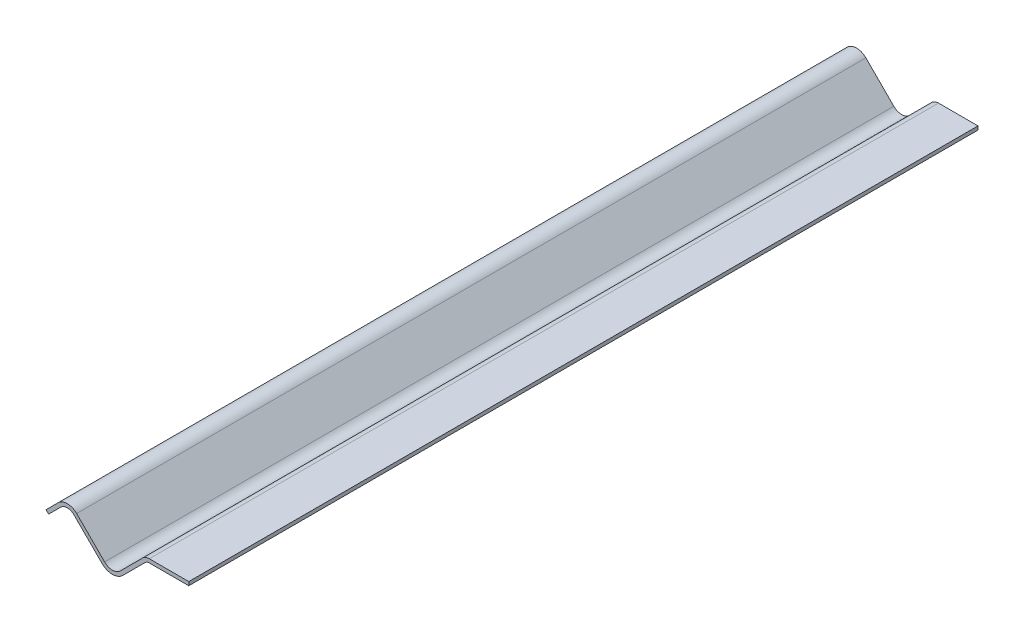
ISO-10303-21;
HEADER;
FILE_DESCRIPTION(('STEP AP214'),'2;1');
FILE_NAME('part.step','',(''),(''),'','','');
FILE_SCHEMA(('AUTOMOTIVE_DESIGN { 1 0 10303 214 1 1 1 1 }'));
ENDSEC;
DATA;
#1=APPLICATION_CONTEXT('core data for automotive mechanical design processes');
#2=APPLICATION_PROTOCOL_DEFINITION('international standard','automotive_design',2000,#1);
#3=PRODUCT_CONTEXT('',#1,'mechanical');
#4=PRODUCT('Part','Part','',(#3));
#5=PRODUCT_RELATED_PRODUCT_CATEGORY('part','',(#4));
#6=PRODUCT_DEFINITION_FORMATION('','',#4);
#7=PRODUCT_DEFINITION_CONTEXT('part definition',#1,'design');
#8=PRODUCT_DEFINITION('design','',#6,#7);
#9=PRODUCT_DEFINITION_SHAPE('','',#8);
#10=(LENGTH_UNIT() NAMED_UNIT(*) SI_UNIT(.MILLI.,.METRE.));
#11=(NAMED_UNIT(*) PLANE_ANGLE_UNIT() SI_UNIT($,.RADIAN.));
#12=(NAMED_UNIT(*) SI_UNIT($,.STERADIAN.) SOLID_ANGLE_UNIT());
#13=UNCERTAINTY_MEASURE_WITH_UNIT(LENGTH_MEASURE(1.E-05),#10,'distance_accuracy_value','');
#14=(GEOMETRIC_REPRESENTATION_CONTEXT(3) GLOBAL_UNCERTAINTY_ASSIGNED_CONTEXT((#13)) GLOBAL_UNIT_ASSIGNED_CONTEXT((#10,
#11,#12)) REPRESENTATION_CONTEXT('',''));
#15=CARTESIAN_POINT('',(0.,0.,0.));
#16=DIRECTION('',(0.,0.,1.));
#17=DIRECTION('',(1.,0.,0.));
#18=AXIS2_PLACEMENT_3D('',#15,#16,#17);
#19=CARTESIAN_POINT('',(0.497947792815748,-0.497947792815748,76.073));
#20=DIRECTION('',(0.707106781186547,0.707106781186548,0.));
#21=DIRECTION('',(-0.707106781186548,0.707106781186547,0.));
#22=AXIS2_PLACEMENT_3D('',#19,#20,#21);
#23=PLANE('',#22);
#24=DIRECTION('',(0.707106781186548,-0.707106781186547,0.));
#25=VECTOR('',#24,1.);
#26=CARTESIAN_POINT('',(0.497947792815748,-0.497947792815748,-76.073));
#27=LINE('',#26,#25);
#28=CARTESIAN_POINT('',(0.,0.,-76.073));
#29=VERTEX_POINT('',#28);
#30=CARTESIAN_POINT('',(0.497947792815748,-0.497947792815748,-76.073));
#31=VERTEX_POINT('',#30);
#32=EDGE_CURVE('E177',#29,#31,#27,.T.);
#33=ORIENTED_EDGE('',*,*,#32,.T.);
#34=DIRECTION('',(0.,0.,-1.));
#35=VECTOR('',#34,1.);
#36=CARTESIAN_POINT('',(0.497947792815748,-0.497947792815748,76.073));
#37=LINE('',#36,#35);
#38=CARTESIAN_POINT('',(0.497947792815748,-0.497947792815748,76.073));
#39=VERTEX_POINT('',#38);
#40=EDGE_CURVE('E11',#39,#31,#37,.T.);
#41=ORIENTED_EDGE('',*,*,#40,.F.);
#42=DIRECTION('',(0.707106781186548,-0.707106781186547,0.));
#43=VECTOR('',#42,1.);
#44=CARTESIAN_POINT('',(0.497947792815748,-0.497947792815748,76.073));
#45=LINE('',#44,#43);
#46=CARTESIAN_POINT('',(0.,0.,76.073));
#47=VERTEX_POINT('',#46);
#48=EDGE_CURVE('E207',#47,#39,#45,.T.);
#49=ORIENTED_EDGE('',*,*,#48,.F.);
#50=DIRECTION('',(0.,0.,-1.));
#51=VECTOR('',#50,1.);
#52=CARTESIAN_POINT('',(0.,0.,76.073));
#53=LINE('',#52,#51);
#54=EDGE_CURVE('E173',#47,#29,#53,.T.);
#55=ORIENTED_EDGE('',*,*,#54,.T.);
#56=EDGE_LOOP('',(#33,#41,#49,#55));
#57=FACE_BOUND('',#56,.T.);
#58=ADVANCED_FACE('F33',(#57),#23,.F.);
#59=CARTESIAN_POINT('',(2.81731108636415,1.82141550073266,76.073));
#60=DIRECTION('',(-0.707106781186549,0.707106781186546,0.));
#61=DIRECTION('',(-0.707106781186546,-0.707106781186549,0.));
#62=AXIS2_PLACEMENT_3D('',#59,#60,#61);
#63=PLANE('',#62);
#64=DIRECTION('',(0.707106781186546,0.707106781186549,0.));
#65=VECTOR('',#64,1.);
#66=CARTESIAN_POINT('',(2.81731108636415,1.82141550073266,-76.073));
#67=LINE('',#66,#65);
#68=CARTESIAN_POINT('',(2.81731108636415,1.82141550073266,-76.073));
#69=VERTEX_POINT('',#68);
#70=EDGE_CURVE('E180',#31,#69,#67,.T.);
#71=ORIENTED_EDGE('',*,*,#70,.T.);
#72=DIRECTION('',(0.,0.,-1.));
#73=VECTOR('',#72,1.);
#74=CARTESIAN_POINT('',(2.81731108636415,1.82141550073266,76.073));
#75=LINE('',#74,#73);
#76=CARTESIAN_POINT('',(2.81731108636415,1.82141550073266,76.073));
#77=VERTEX_POINT('',#76);
#78=EDGE_CURVE('E41',#77,#69,#75,.T.);
#79=ORIENTED_EDGE('',*,*,#78,.F.);
#80=DIRECTION('',(0.707106781186546,0.707106781186549,0.));
#81=VECTOR('',#80,1.);
#82=CARTESIAN_POINT('',(2.81731108636415,1.82141550073266,76.073));
#83=LINE('',#82,#81);
#84=EDGE_CURVE('E116',#39,#77,#83,.T.);
#85=ORIENTED_EDGE('',*,*,#84,.F.);
#86=ORIENTED_EDGE('',*,*,#40,.T.);
#87=EDGE_LOOP('',(#71,#79,#85,#86));
#88=FACE_BOUND('',#87,.T.);
#89=ADVANCED_FACE('F305',(#88),#63,.F.);
#90=CARTESIAN_POINT('',(4.11283416820805,0.525892418888756,76.073));
#91=DIRECTION('',(0.,0.,-1.));
#92=DIRECTION('',(-1.,0.,0.));
#93=AXIS2_PLACEMENT_3D('',#90,#91,#92);
#94=CYLINDRICAL_SURFACE('',#93,1.83214631271104);
#95=CARTESIAN_POINT('',(4.11283416820805,0.525892418888756,-76.073));
#96=DIRECTION('',(0.,0.,-1.));
#97=DIRECTION('',(1.,0.,0.));
#98=AXIS2_PLACEMENT_3D('',#95,#96,#97);
#99=CIRCLE('',#98,1.83214631271104);
#100=CARTESIAN_POINT('',(5.40835725005195,1.82141550073266,-76.073));
#101=VERTEX_POINT('',#100);
#102=EDGE_CURVE('E182',#69,#101,#99,.T.);
#103=ORIENTED_EDGE('',*,*,#102,.T.);
#104=DIRECTION('',(0.,0.,-1.));
#105=VECTOR('',#104,1.);
#106=CARTESIAN_POINT('',(5.40835725005195,1.82141550073266,76.073));
#107=LINE('',#106,#105);
#108=CARTESIAN_POINT('',(5.40835725005195,1.82141550073266,76.073));
#109=VERTEX_POINT('',#108);
#110=EDGE_CURVE('E238',#109,#101,#107,.T.);
#111=ORIENTED_EDGE('',*,*,#110,.F.);
#112=CARTESIAN_POINT('',(4.11283416820805,0.525892418888756,76.073));
#113=DIRECTION('',(0.,0.,-1.));
#114=DIRECTION('',(1.,0.,0.));
#115=AXIS2_PLACEMENT_3D('',#112,#113,#114);
#116=CIRCLE('',#115,1.83214631271104);
#117=EDGE_CURVE('E246',#77,#109,#116,.T.);
#118=ORIENTED_EDGE('',*,*,#117,.F.);
#119=ORIENTED_EDGE('',*,*,#78,.T.);
#120=EDGE_LOOP('',(#103,#111,#118,#119));
#121=FACE_BOUND('',#120,.T.);
#122=ADVANCED_FACE('F244',(#121),#94,.F.);
#123=CARTESIAN_POINT('',(10.7965109226934,-3.56673817190883,76.073));
#124=DIRECTION('',(0.707106781186547,0.707106781186548,0.));
#125=DIRECTION('',(-0.707106781186548,0.707106781186547,0.));
#126=AXIS2_PLACEMENT_3D('',#123,#124,#125);
#127=PLANE('',#126);
#128=DIRECTION('',(0.707106781186548,-0.707106781186547,0.));
#129=VECTOR('',#128,1.);
#130=CARTESIAN_POINT('',(10.7965109226934,-3.56673817190883,-76.073));
#131=LINE('',#130,#129);
#132=CARTESIAN_POINT('',(10.7965109226934,-3.56673817190883,-76.073));
#133=VERTEX_POINT('',#132);
#134=EDGE_CURVE('E184',#101,#133,#131,.T.);
#135=ORIENTED_EDGE('',*,*,#134,.T.);
#136=DIRECTION('',(0.,0.,-1.));
#137=VECTOR('',#136,1.);
#138=CARTESIAN_POINT('',(10.7965109226934,-3.56673817190883,76.073));
#139=LINE('',#138,#137);
#140=CARTESIAN_POINT('',(10.7965109226934,-3.56673817190883,76.073));
#141=VERTEX_POINT('',#140);
#142=EDGE_CURVE('E235',#141,#133,#139,.T.);
#143=ORIENTED_EDGE('',*,*,#142,.F.);
#144=DIRECTION('',(0.707106781186548,-0.707106781186547,0.));
#145=VECTOR('',#144,1.);
#146=CARTESIAN_POINT('',(10.7965109226934,-3.56673817190883,76.073));
#147=LINE('',#146,#145);
#148=EDGE_CURVE('E264',#109,#141,#147,.T.);
#149=ORIENTED_EDGE('',*,*,#148,.F.);
#150=ORIENTED_EDGE('',*,*,#110,.T.);
#151=EDGE_LOOP('',(#135,#143,#149,#150));
#152=FACE_BOUND('',#151,.T.);
#153=ADVANCED_FACE('F255',(#152),#127,.F.);
#154=CARTESIAN_POINT('',(12.8019671361045,-1.56128195849773,76.073));
#155=DIRECTION('',(0.,0.,-1.));
#156=DIRECTION('',(-1.,0.,0.));
#157=AXIS2_PLACEMENT_3D('',#154,#155,#156);
#158=CYLINDRICAL_SURFACE('',#157,2.83614337575137);
#159=CARTESIAN_POINT('',(12.8019671361045,-1.56128195849773,-76.073));
#160=DIRECTION('',(0.,0.,1.));
#161=DIRECTION('',(-1.,0.,0.));
#162=AXIS2_PLACEMENT_3D('',#159,#160,#161);
#163=CIRCLE('',#162,2.83614337575137);
#164=CARTESIAN_POINT('',(14.8074233495156,-3.56673817190883,-76.073));
#165=VERTEX_POINT('',#164);
#166=EDGE_CURVE('E186',#133,#165,#163,.T.);
#167=ORIENTED_EDGE('',*,*,#166,.T.);
#168=DIRECTION('',(0.,0.,-1.));
#169=VECTOR('',#168,1.);
#170=CARTESIAN_POINT('',(14.8074233495156,-3.56673817190883,76.073));
#171=LINE('',#170,#169);
#172=CARTESIAN_POINT('',(14.8074233495156,-3.56673817190883,76.073));
#173=VERTEX_POINT('',#172);
#174=EDGE_CURVE('E232',#173,#165,#171,.T.);
#175=ORIENTED_EDGE('',*,*,#174,.F.);
#176=CARTESIAN_POINT('',(12.8019671361045,-1.56128195849773,76.073));
#177=DIRECTION('',(0.,0.,1.));
#178=DIRECTION('',(-1.,0.,0.));
#179=AXIS2_PLACEMENT_3D('',#176,#177,#178);
#180=CIRCLE('',#179,2.83614337575137);
#181=EDGE_CURVE('E261',#141,#173,#180,.T.);
#182=ORIENTED_EDGE('',*,*,#181,.F.);
#183=ORIENTED_EDGE('',*,*,#142,.T.);
#184=EDGE_LOOP('',(#167,#175,#182,#183));
#185=FACE_BOUND('',#184,.T.);
#186=ADVANCED_FACE('F259',(#185),#158,.T.);
#187=CARTESIAN_POINT('',(19.1097693285375,0.735607807113074,76.073));
#188=DIRECTION('',(-0.707106781186548,0.707106781186547,0.));
#189=DIRECTION('',(-0.707106781186547,-0.707106781186548,0.));
#190=AXIS2_PLACEMENT_3D('',#187,#188,#189);
#191=PLANE('',#190);
#192=DIRECTION('',(0.707106781186547,0.707106781186548,0.));
#193=VECTOR('',#192,1.);
#194=CARTESIAN_POINT('',(19.1097693285375,0.735607807113074,-76.073));
#195=LINE('',#194,#193);
#196=CARTESIAN_POINT('',(19.1097693285375,0.735607807113074,-76.073));
#197=VERTEX_POINT('',#196);
#198=EDGE_CURVE('E188',#165,#197,#195,.T.);
#199=ORIENTED_EDGE('',*,*,#198,.T.);
#200=DIRECTION('',(0.,0.,-1.));
#201=VECTOR('',#200,1.);
#202=CARTESIAN_POINT('',(19.1097693285375,0.735607807113074,76.073));
#203=LINE('',#202,#201);
#204=CARTESIAN_POINT('',(19.1097693285375,0.735607807113074,76.073));
#205=VERTEX_POINT('',#204);
#206=EDGE_CURVE('E229',#205,#197,#203,.T.);
#207=ORIENTED_EDGE('',*,*,#206,.F.);
#208=DIRECTION('',(0.707106781186547,0.707106781186548,0.));
#209=VECTOR('',#208,1.);
#210=CARTESIAN_POINT('',(19.1097693285375,0.735607807113074,76.073));
#211=LINE('',#210,#209);
#212=EDGE_CURVE('E263',#173,#205,#211,.T.);
#213=ORIENTED_EDGE('',*,*,#212,.F.);
#214=ORIENTED_EDGE('',*,*,#174,.T.);
#215=EDGE_LOOP('',(#199,#207,#213,#214));
#216=FACE_BOUND('',#215,.T.);
#217=ADVANCED_FACE('F318',(#216),#191,.F.);
#218=CARTESIAN_POINT('',(19.9022764008965,-0.0568992652459051,76.073));
#219=DIRECTION('',(0.,0.,-1.));
#220=DIRECTION('',(-1.,0.,0.));
#221=AXIS2_PLACEMENT_3D('',#218,#219,#220);
#222=CYLINDRICAL_SURFACE('',#221,1.12077425000666);
#223=CARTESIAN_POINT('',(19.9022764008965,-0.0568992652459051,-76.073));
#224=DIRECTION('',(0.,0.,-1.));
#225=DIRECTION('',(1.,0.,0.));
#226=AXIS2_PLACEMENT_3D('',#223,#224,#225);
#227=CIRCLE('',#226,1.12077425000666);
#228=CARTESIAN_POINT('',(19.9022764008965,1.06387498476076,-76.073));
#229=VERTEX_POINT('',#228);
#230=EDGE_CURVE('E190',#197,#229,#227,.T.);
#231=ORIENTED_EDGE('',*,*,#230,.T.);
#232=DIRECTION('',(0.,0.,-1.));
#233=VECTOR('',#232,1.);
#234=CARTESIAN_POINT('',(19.9022764008965,1.06387498476076,76.073));
#235=LINE('',#234,#233);
#236=CARTESIAN_POINT('',(19.9022764008965,1.06387498476076,76.073));
#237=VERTEX_POINT('',#236);
#238=EDGE_CURVE('E226',#237,#229,#235,.T.);
#239=ORIENTED_EDGE('',*,*,#238,.F.);
#240=CARTESIAN_POINT('',(19.9022764008965,-0.0568992652459051,76.073));
#241=DIRECTION('',(0.,0.,-1.));
#242=DIRECTION('',(1.,0.,0.));
#243=AXIS2_PLACEMENT_3D('',#240,#241,#242);
#244=CIRCLE('',#243,1.12077425000666);
#245=EDGE_CURVE('E266',#205,#237,#244,.T.);
#246=ORIENTED_EDGE('',*,*,#245,.F.);
#247=ORIENTED_EDGE('',*,*,#206,.T.);
#248=EDGE_LOOP('',(#231,#239,#246,#247));
#249=FACE_BOUND('',#248,.T.);
#250=ADVANCED_FACE('F321',(#249),#222,.F.);
#251=CARTESIAN_POINT('',(27.5222764008965,1.06387498476076,76.073));
#252=DIRECTION('',(0.,1.,0.));
#253=DIRECTION('',(-1.,0.,0.));
#254=AXIS2_PLACEMENT_3D('',#251,#252,#253);
#255=PLANE('',#254);
#256=DIRECTION('',(1.,0.,0.));
#257=VECTOR('',#256,1.);
#258=CARTESIAN_POINT('',(27.5222764008965,1.06387498476076,-76.073));
#259=LINE('',#258,#257);
#260=CARTESIAN_POINT('',(27.5222764008965,1.06387498476076,-76.073));
#261=VERTEX_POINT('',#260);
#262=EDGE_CURVE('E192',#229,#261,#259,.T.);
#263=ORIENTED_EDGE('',*,*,#262,.T.);
#264=DIRECTION('',(0.,0.,-1.));
#265=VECTOR('',#264,1.);
#266=CARTESIAN_POINT('',(27.5222764008965,1.06387498476076,76.073));
#267=LINE('',#266,#265);
#268=CARTESIAN_POINT('',(27.5222764008965,1.06387498476076,76.073));
#269=VERTEX_POINT('',#268);
#270=EDGE_CURVE('E223',#269,#261,#267,.T.);
#271=ORIENTED_EDGE('',*,*,#270,.F.);
#272=DIRECTION('',(1.,0.,0.));
#273=VECTOR('',#272,1.);
#274=CARTESIAN_POINT('',(27.5222764008965,1.06387498476076,76.073));
#275=LINE('',#274,#273);
#276=EDGE_CURVE('E272',#237,#269,#275,.T.);
#277=ORIENTED_EDGE('',*,*,#276,.F.);
#278=ORIENTED_EDGE('',*,*,#238,.T.);
#279=EDGE_LOOP('',(#263,#271,#277,#278));
#280=FACE_BOUND('',#279,.T.);
#281=ADVANCED_FACE('F325',(#280),#255,.F.);
#282=CARTESIAN_POINT('',(27.5222764008965,1.76807950671453,76.073));
#283=DIRECTION('',(-1.,0.,0.));
#284=DIRECTION('',(0.,0.,1.));
#285=AXIS2_PLACEMENT_3D('',#282,#283,#284);
#286=PLANE('',#285);
#287=DIRECTION('',(0.,1.,0.));
#288=VECTOR('',#287,1.);
#289=CARTESIAN_POINT('',(27.5222764008965,1.76807950671453,-76.073));
#290=LINE('',#289,#288);
#291=CARTESIAN_POINT('',(27.5222764008965,1.76807950671453,-76.073));
#292=VERTEX_POINT('',#291);
#293=EDGE_CURVE('E194',#261,#292,#290,.T.);
#294=ORIENTED_EDGE('',*,*,#293,.T.);
#295=DIRECTION('',(0.,0.,-1.));
#296=VECTOR('',#295,1.);
#297=CARTESIAN_POINT('',(27.5222764008965,1.76807950671453,76.073));
#298=LINE('',#297,#296);
#299=CARTESIAN_POINT('',(27.5222764008965,1.76807950671453,76.073));
#300=VERTEX_POINT('',#299);
#301=EDGE_CURVE('E220',#300,#292,#298,.T.);
#302=ORIENTED_EDGE('',*,*,#301,.F.);
#303=DIRECTION('',(0.,1.,0.));
#304=VECTOR('',#303,1.);
#305=CARTESIAN_POINT('',(27.5222764008965,1.76807950671453,76.073));
#306=LINE('',#305,#304);
#307=EDGE_CURVE('E274',#269,#300,#306,.T.);
#308=ORIENTED_EDGE('',*,*,#307,.F.);
#309=ORIENTED_EDGE('',*,*,#270,.T.);
#310=EDGE_LOOP('',(#294,#302,#308,#309));
#311=FACE_BOUND('',#310,.T.);
#312=ADVANCED_FACE('F329',(#311),#286,.F.);
#313=CARTESIAN_POINT('',(19.9022764008965,1.76807950671453,76.073));
#314=DIRECTION('',(0.,-1.,0.));
#315=DIRECTION('',(0.,0.,-1.));
#316=AXIS2_PLACEMENT_3D('',#313,#314,#315);
#317=PLANE('',#316);
#318=DIRECTION('',(-1.,0.,0.));
#319=VECTOR('',#318,1.);
#320=CARTESIAN_POINT('',(19.9022764008965,1.76807950671453,-76.073));
#321=LINE('',#320,#319);
#322=CARTESIAN_POINT('',(19.9022764008965,1.76807950671453,-76.073));
#323=VERTEX_POINT('',#322);
#324=EDGE_CURVE('E196',#292,#323,#321,.T.);
#325=ORIENTED_EDGE('',*,*,#324,.T.);
#326=DIRECTION('',(0.,0.,-1.));
#327=VECTOR('',#326,1.);
#328=CARTESIAN_POINT('',(19.9022764008965,1.76807950671453,76.073));
#329=LINE('',#328,#327);
#330=CARTESIAN_POINT('',(19.9022764008965,1.76807950671453,76.073));
#331=VERTEX_POINT('',#330);
#332=EDGE_CURVE('E217',#331,#323,#329,.T.);
#333=ORIENTED_EDGE('',*,*,#332,.F.);
#334=DIRECTION('',(-1.,0.,0.));
#335=VECTOR('',#334,1.);
#336=CARTESIAN_POINT('',(19.9022764008965,1.76807950671453,76.073));
#337=LINE('',#336,#335);
#338=EDGE_CURVE('E276',#300,#331,#337,.T.);
#339=ORIENTED_EDGE('',*,*,#338,.F.);
#340=ORIENTED_EDGE('',*,*,#301,.T.);
#341=EDGE_LOOP('',(#325,#333,#339,#340));
#342=FACE_BOUND('',#341,.T.);
#343=ADVANCED_FACE('F333',(#342),#317,.F.);
#344=CARTESIAN_POINT('',(19.9022764008965,-0.0568992652459051,76.073));
#345=DIRECTION('',(0.,0.,-1.));
#346=DIRECTION('',(-1.,0.,0.));
#347=AXIS2_PLACEMENT_3D('',#344,#345,#346);
#348=CYLINDRICAL_SURFACE('',#347,1.82497877196044);
#349=CARTESIAN_POINT('',(19.9022764008965,-0.0568992652459051,-76.073));
#350=DIRECTION('',(0.,0.,1.));
#351=DIRECTION('',(-1.,0.,0.));
#352=AXIS2_PLACEMENT_3D('',#349,#350,#351);
#353=CIRCLE('',#352,1.82497877196044);
#354=CARTESIAN_POINT('',(18.6118215357218,1.23355559992882,-76.073));
#355=VERTEX_POINT('',#354);
#356=EDGE_CURVE('E198',#323,#355,#353,.T.);
#357=ORIENTED_EDGE('',*,*,#356,.T.);
#358=DIRECTION('',(0.,0.,-1.));
#359=VECTOR('',#358,1.);
#360=CARTESIAN_POINT('',(18.6118215357218,1.23355559992882,76.073));
#361=LINE('',#360,#359);
#362=CARTESIAN_POINT('',(18.6118215357218,1.23355559992882,76.073));
#363=VERTEX_POINT('',#362);
#364=EDGE_CURVE('E214',#363,#355,#361,.T.);
#365=ORIENTED_EDGE('',*,*,#364,.F.);
#366=CARTESIAN_POINT('',(19.9022764008965,-0.0568992652459051,76.073));
#367=DIRECTION('',(0.,0.,1.));
#368=DIRECTION('',(-1.,0.,0.));
#369=AXIS2_PLACEMENT_3D('',#366,#367,#368);
#370=CIRCLE('',#369,1.82497877196044);
#371=EDGE_CURVE('E278',#331,#363,#370,.T.);
#372=ORIENTED_EDGE('',*,*,#371,.F.);
#373=ORIENTED_EDGE('',*,*,#332,.T.);
#374=EDGE_LOOP('',(#357,#365,#372,#373));
#375=FACE_BOUND('',#374,.T.);
#376=ADVANCED_FACE('F337',(#375),#348,.T.);
#377=CARTESIAN_POINT('',(14.3094755566999,-3.06879037909308,76.073));
#378=DIRECTION('',(0.707106781186548,-0.707106781186547,0.));
#379=DIRECTION('',(0.707106781186547,0.707106781186548,0.));
#380=AXIS2_PLACEMENT_3D('',#377,#378,#379);
#381=PLANE('',#380);
#382=DIRECTION('',(-0.707106781186547,-0.707106781186548,0.));
#383=VECTOR('',#382,1.);
#384=CARTESIAN_POINT('',(14.3094755566999,-3.06879037909308,-76.073));
#385=LINE('',#384,#383);
#386=CARTESIAN_POINT('',(14.3094755566999,-3.06879037909308,-76.073));
#387=VERTEX_POINT('',#386);
#388=EDGE_CURVE('E200',#355,#387,#385,.T.);
#389=ORIENTED_EDGE('',*,*,#388,.T.);
#390=DIRECTION('',(0.,0.,-1.));
#391=VECTOR('',#390,1.);
#392=CARTESIAN_POINT('',(14.3094755566999,-3.06879037909308,76.073));
#393=LINE('',#392,#391);
#394=CARTESIAN_POINT('',(14.3094755566999,-3.06879037909308,76.073));
#395=VERTEX_POINT('',#394);
#396=EDGE_CURVE('E211',#395,#387,#393,.T.);
#397=ORIENTED_EDGE('',*,*,#396,.F.);
#398=DIRECTION('',(-0.707106781186547,-0.707106781186548,0.));
#399=VECTOR('',#398,1.);
#400=CARTESIAN_POINT('',(14.3094755566999,-3.06879037909308,76.073));
#401=LINE('',#400,#399);
#402=EDGE_CURVE('E280',#363,#395,#401,.T.);
#403=ORIENTED_EDGE('',*,*,#402,.F.);
#404=ORIENTED_EDGE('',*,*,#364,.T.);
#405=EDGE_LOOP('',(#389,#397,#403,#404));
#406=FACE_BOUND('',#405,.T.);
#407=ADVANCED_FACE('F286',(#406),#381,.F.);
#408=CARTESIAN_POINT('',(12.8019671361045,-1.56128195849773,76.073));
#409=DIRECTION('',(0.,0.,-1.));
#410=DIRECTION('',(-1.,0.,0.));
#411=AXIS2_PLACEMENT_3D('',#408,#409,#410);
#412=CYLINDRICAL_SURFACE('',#411,2.13193885379759);
#413=CARTESIAN_POINT('',(12.8019671361045,-1.56128195849773,-76.073));
#414=DIRECTION('',(0.,0.,-1.));
#415=DIRECTION('',(1.,0.,0.));
#416=AXIS2_PLACEMENT_3D('',#413,#414,#415);
#417=CIRCLE('',#416,2.13193885379759);
#418=CARTESIAN_POINT('',(11.2944587155092,-3.06879037909308,-76.073));
#419=VERTEX_POINT('',#418);
#420=EDGE_CURVE('E202',#387,#419,#417,.T.);
#421=ORIENTED_EDGE('',*,*,#420,.T.);
#422=DIRECTION('',(0.,0.,-1.));
#423=VECTOR('',#422,1.);
#424=CARTESIAN_POINT('',(11.2944587155092,-3.06879037909308,76.073));
#425=LINE('',#424,#423);
#426=CARTESIAN_POINT('',(11.2944587155092,-3.06879037909308,76.073));
#427=VERTEX_POINT('',#426);
#428=EDGE_CURVE('E168',#427,#419,#425,.T.);
#429=ORIENTED_EDGE('',*,*,#428,.F.);
#430=CARTESIAN_POINT('',(12.8019671361045,-1.56128195849773,76.073));
#431=DIRECTION('',(0.,0.,-1.));
#432=DIRECTION('',(1.,0.,0.));
#433=AXIS2_PLACEMENT_3D('',#430,#431,#432);
#434=CIRCLE('',#433,2.13193885379759);
#435=EDGE_CURVE('E159',#395,#427,#434,.T.);
#436=ORIENTED_EDGE('',*,*,#435,.F.);
#437=ORIENTED_EDGE('',*,*,#396,.T.);
#438=EDGE_LOOP('',(#421,#429,#436,#437));
#439=FACE_BOUND('',#438,.T.);
#440=ADVANCED_FACE('F290',(#439),#412,.F.);
#441=CARTESIAN_POINT('',(5.9063050428677,2.31936329354841,76.073));
#442=DIRECTION('',(-0.707106781186547,-0.707106781186548,0.));
#443=DIRECTION('',(0.707106781186548,-0.707106781186547,0.));
#444=AXIS2_PLACEMENT_3D('',#441,#442,#443);
#445=PLANE('',#444);
#446=DIRECTION('',(-0.707106781186548,0.707106781186547,0.));
#447=VECTOR('',#446,1.);
#448=CARTESIAN_POINT('',(5.9063050428677,2.31936329354841,-76.073));
#449=LINE('',#448,#447);
#450=CARTESIAN_POINT('',(5.9063050428677,2.31936329354841,-76.073));
#451=VERTEX_POINT('',#450);
#452=EDGE_CURVE('E167',#419,#451,#449,.T.);
#453=ORIENTED_EDGE('',*,*,#452,.T.);
#454=DIRECTION('',(0.,0.,-1.));
#455=VECTOR('',#454,1.);
#456=CARTESIAN_POINT('',(5.9063050428677,2.31936329354841,76.073));
#457=LINE('',#456,#455);
#458=CARTESIAN_POINT('',(5.9063050428677,2.31936329354841,76.073));
#459=VERTEX_POINT('',#458);
#460=EDGE_CURVE('E164',#459,#451,#457,.T.);
#461=ORIENTED_EDGE('',*,*,#460,.F.);
#462=DIRECTION('',(-0.707106781186548,0.707106781186547,0.));
#463=VECTOR('',#462,1.);
#464=CARTESIAN_POINT('',(5.9063050428677,2.31936329354841,76.073));
#465=LINE('',#464,#463);
#466=EDGE_CURVE('E153',#427,#459,#465,.T.);
#467=ORIENTED_EDGE('',*,*,#466,.F.);
#468=ORIENTED_EDGE('',*,*,#428,.T.);
#469=EDGE_LOOP('',(#453,#461,#467,#468));
#470=FACE_BOUND('',#469,.T.);
#471=ADVANCED_FACE('F165',(#470),#445,.F.);
#472=CARTESIAN_POINT('',(4.11283416820805,0.525892418888756,76.073));
#473=DIRECTION('',(0.,0.,-1.));
#474=DIRECTION('',(-1.,0.,0.));
#475=AXIS2_PLACEMENT_3D('',#472,#473,#474);
#476=CYLINDRICAL_SURFACE('',#475,2.53635083466481);
#477=CARTESIAN_POINT('',(4.11283416820805,0.525892418888756,-76.073));
#478=DIRECTION('',(0.,0.,1.));
#479=DIRECTION('',(-1.,0.,0.));
#480=AXIS2_PLACEMENT_3D('',#477,#478,#479);
#481=CIRCLE('',#480,2.53635083466481);
#482=CARTESIAN_POINT('',(2.3193632935484,2.31936329354841,-76.073));
#483=VERTEX_POINT('',#482);
#484=EDGE_CURVE('E102',#451,#483,#481,.T.);
#485=ORIENTED_EDGE('',*,*,#484,.T.);
#486=DIRECTION('',(0.,0.,-1.));
#487=VECTOR('',#486,1.);
#488=CARTESIAN_POINT('',(2.3193632935484,2.31936329354841,76.073));
#489=LINE('',#488,#487);
#490=CARTESIAN_POINT('',(2.3193632935484,2.31936329354841,76.073));
#491=VERTEX_POINT('',#490);
#492=EDGE_CURVE('E169',#491,#483,#489,.T.);
#493=ORIENTED_EDGE('',*,*,#492,.F.);
#494=CARTESIAN_POINT('',(4.11283416820805,0.525892418888756,76.073));
#495=DIRECTION('',(0.,0.,1.));
#496=DIRECTION('',(-1.,0.,0.));
#497=AXIS2_PLACEMENT_3D('',#494,#495,#496);
#498=CIRCLE('',#497,2.53635083466481);
#499=EDGE_CURVE('E157',#459,#491,#498,.T.);
#500=ORIENTED_EDGE('',*,*,#499,.F.);
#501=ORIENTED_EDGE('',*,*,#460,.T.);
#502=EDGE_LOOP('',(#485,#493,#500,#501));
#503=FACE_BOUND('',#502,.T.);
#504=ADVANCED_FACE('F171',(#503),#476,.T.);
#505=CARTESIAN_POINT('',(0.,0.,76.073));
#506=DIRECTION('',(0.707106781186548,-0.707106781186547,0.));
#507=DIRECTION('',(0.707106781186547,0.707106781186548,0.));
#508=AXIS2_PLACEMENT_3D('',#505,#506,#507);
#509=PLANE('',#508);
#510=DIRECTION('',(-0.707106781186547,-0.707106781186548,0.));
#511=VECTOR('',#510,1.);
#512=CARTESIAN_POINT('',(0.,0.,-76.073));
#513=LINE('',#512,#511);
#514=EDGE_CURVE('E108',#483,#29,#513,.T.);
#515=ORIENTED_EDGE('',*,*,#514,.T.);
#516=ORIENTED_EDGE('',*,*,#54,.F.);
#517=DIRECTION('',(-0.707106781186547,-0.707106781186548,0.));
#518=VECTOR('',#517,1.);
#519=CARTESIAN_POINT('',(0.,0.,76.073));
#520=LINE('',#519,#518);
#521=EDGE_CURVE('E49',#491,#47,#520,.T.);
#522=ORIENTED_EDGE('',*,*,#521,.F.);
#523=ORIENTED_EDGE('',*,*,#492,.T.);
#524=EDGE_LOOP('',(#515,#516,#522,#523));
#525=FACE_BOUND('',#524,.T.);
#526=ADVANCED_FACE('F294',(#525),#509,.F.);
#527=CARTESIAN_POINT('',(4.11283416820805,0.525892418888756,76.073));
#528=DIRECTION('',(0.,0.,-1.));
#529=DIRECTION('',(-1.,0.,0.));
#530=AXIS2_PLACEMENT_3D('',#527,#528,#529);
#531=PLANE('',#530);
#532=ORIENTED_EDGE('',*,*,#48,.T.);
#533=ORIENTED_EDGE('',*,*,#84,.T.);
#534=ORIENTED_EDGE('',*,*,#117,.T.);
#535=ORIENTED_EDGE('',*,*,#148,.T.);
#536=ORIENTED_EDGE('',*,*,#181,.T.);
#537=ORIENTED_EDGE('',*,*,#212,.T.);
#538=ORIENTED_EDGE('',*,*,#245,.T.);
#539=ORIENTED_EDGE('',*,*,#276,.T.);
#540=ORIENTED_EDGE('',*,*,#307,.T.);
#541=ORIENTED_EDGE('',*,*,#338,.T.);
#542=ORIENTED_EDGE('',*,*,#371,.T.);
#543=ORIENTED_EDGE('',*,*,#402,.T.);
#544=ORIENTED_EDGE('',*,*,#435,.T.);
#545=ORIENTED_EDGE('',*,*,#466,.T.);
#546=ORIENTED_EDGE('',*,*,#499,.T.);
#547=ORIENTED_EDGE('',*,*,#521,.T.);
#548=EDGE_LOOP('',(#532,#533,#534,#535,#536,#537,#538,#539,#540,#541,#542,#543,#544,#545,#546,#547));
#549=FACE_BOUND('',#548,.T.);
#550=ADVANCED_FACE('F155',(#549),#531,.F.);
#551=CARTESIAN_POINT('',(4.11283416820805,0.525892418888756,-76.073));
#552=DIRECTION('',(0.,0.,-1.));
#553=DIRECTION('',(-1.,0.,0.));
#554=AXIS2_PLACEMENT_3D('',#551,#552,#553);
#555=PLANE('',#554);
#556=ORIENTED_EDGE('',*,*,#32,.F.);
#557=ORIENTED_EDGE('',*,*,#514,.F.);
#558=ORIENTED_EDGE('',*,*,#484,.F.);
#559=ORIENTED_EDGE('',*,*,#452,.F.);
#560=ORIENTED_EDGE('',*,*,#420,.F.);
#561=ORIENTED_EDGE('',*,*,#388,.F.);
#562=ORIENTED_EDGE('',*,*,#356,.F.);
#563=ORIENTED_EDGE('',*,*,#324,.F.);
#564=ORIENTED_EDGE('',*,*,#293,.F.);
#565=ORIENTED_EDGE('',*,*,#262,.F.);
#566=ORIENTED_EDGE('',*,*,#230,.F.);
#567=ORIENTED_EDGE('',*,*,#198,.F.);
#568=ORIENTED_EDGE('',*,*,#166,.F.);
#569=ORIENTED_EDGE('',*,*,#134,.F.);
#570=ORIENTED_EDGE('',*,*,#102,.F.);
#571=ORIENTED_EDGE('',*,*,#70,.F.);
#572=EDGE_LOOP('',(#556,#557,#558,#559,#560,#561,#562,#563,#564,#565,#566,#567,#568,#569,#570,#571));
#573=FACE_BOUND('',#572,.T.);
#574=ADVANCED_FACE('F250',(#573),#555,.T.);
#575=CLOSED_SHELL('',(#58,#89,#122,#153,#186,#217,#250,#281,#312,#343,#376,#407,#440,#471,#504,
#526,#550,#574));
#576=MANIFOLD_SOLID_BREP('B2',#575);
#577=ADVANCED_BREP_SHAPE_REPRESENTATION('',(#18,#576),#14);
#578=SHAPE_DEFINITION_REPRESENTATION(#9,#577);
ENDSEC;
END-ISO-10303-21;
